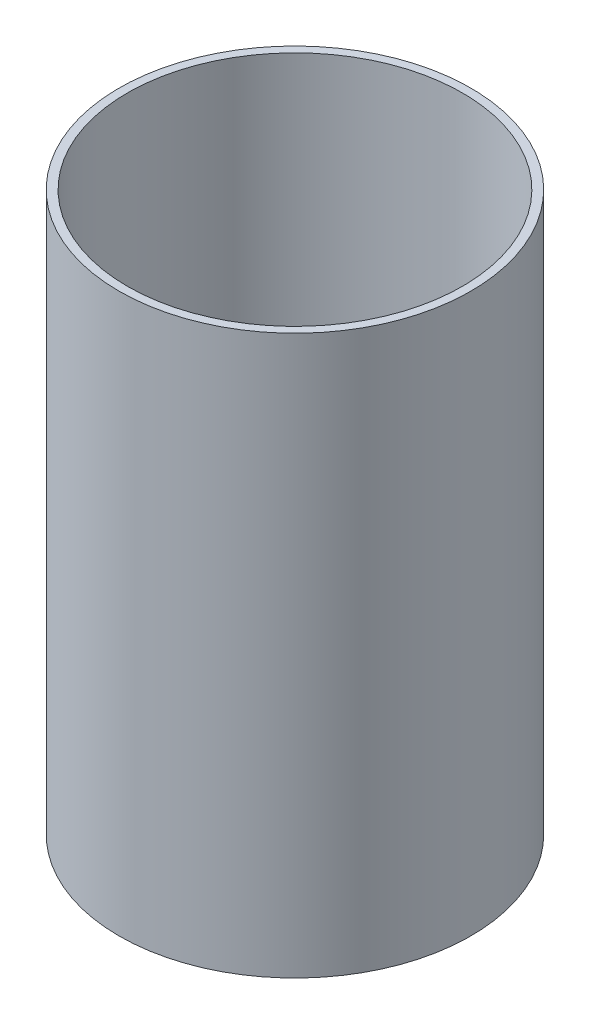
ISO-10303-21;
HEADER;
FILE_DESCRIPTION(('STEP AP214'),'2;1');
FILE_NAME('part.step','',(''),(''),'','','');
FILE_SCHEMA(('AUTOMOTIVE_DESIGN { 1 0 10303 214 1 1 1 1 }'));
ENDSEC;
DATA;
#1=APPLICATION_CONTEXT('core data for automotive mechanical design processes');
#2=APPLICATION_PROTOCOL_DEFINITION('international standard','automotive_design',2000,#1);
#3=PRODUCT_CONTEXT('',#1,'mechanical');
#4=PRODUCT('Part','Part','',(#3));
#5=PRODUCT_RELATED_PRODUCT_CATEGORY('part','',(#4));
#6=PRODUCT_DEFINITION_FORMATION('','',#4);
#7=PRODUCT_DEFINITION_CONTEXT('part definition',#1,'design');
#8=PRODUCT_DEFINITION('design','',#6,#7);
#9=PRODUCT_DEFINITION_SHAPE('','',#8);
#10=(LENGTH_UNIT() NAMED_UNIT(*) SI_UNIT(.MILLI.,.METRE.));
#11=(NAMED_UNIT(*) PLANE_ANGLE_UNIT() SI_UNIT($,.RADIAN.));
#12=(NAMED_UNIT(*) SI_UNIT($,.STERADIAN.) SOLID_ANGLE_UNIT());
#13=UNCERTAINTY_MEASURE_WITH_UNIT(LENGTH_MEASURE(1.E-05),#10,'distance_accuracy_value','');
#14=(GEOMETRIC_REPRESENTATION_CONTEXT(3) GLOBAL_UNCERTAINTY_ASSIGNED_CONTEXT((#13)) GLOBAL_UNIT_ASSIGNED_CONTEXT((#10,
#11,#12)) REPRESENTATION_CONTEXT('',''));
#15=CARTESIAN_POINT('',(0.,0.,0.));
#16=DIRECTION('',(0.,0.,1.));
#17=DIRECTION('',(1.,0.,0.));
#18=AXIS2_PLACEMENT_3D('',#15,#16,#17);
#19=CARTESIAN_POINT('',(0.,100.,0.));
#20=DIRECTION('',(0.,1.,0.));
#21=DIRECTION('',(0.,0.,1.));
#22=AXIS2_PLACEMENT_3D('',#19,#20,#21);
#23=PLANE('',#22);
#24=CARTESIAN_POINT('',(0.,100.,0.));
#25=DIRECTION('',(0.,1.,0.));
#26=DIRECTION('',(0.,0.,1.));
#27=AXIS2_PLACEMENT_3D('',#24,#25,#26);
#28=CIRCLE('',#27,31.5);
#29=CARTESIAN_POINT('',(0.,100.,31.5));
#30=VERTEX_POINT('',#29);
#31=EDGE_CURVE('E10',#30,#30,#28,.T.);
#32=ORIENTED_EDGE('',*,*,#31,.T.);
#33=EDGE_LOOP('',(#32));
#34=FACE_BOUND('',#33,.T.);
#35=CARTESIAN_POINT('',(0.,100.,0.));
#36=DIRECTION('',(0.,1.,0.));
#37=DIRECTION('',(0.,0.,1.));
#38=AXIS2_PLACEMENT_3D('',#35,#36,#37);
#39=CIRCLE('',#38,30.);
#40=CARTESIAN_POINT('',(0.,100.,30.));
#41=VERTEX_POINT('',#40);
#42=EDGE_CURVE('E43',#41,#41,#39,.T.);
#43=ORIENTED_EDGE('',*,*,#42,.F.);
#44=EDGE_LOOP('',(#43));
#45=FACE_BOUND('',#44,.T.);
#46=ADVANCED_FACE('F32',(#34,#45),#23,.T.);
#47=CARTESIAN_POINT('',(0.,0.,0.));
#48=DIRECTION('',(0.,1.,0.));
#49=DIRECTION('',(0.,0.,1.));
#50=AXIS2_PLACEMENT_3D('',#47,#48,#49);
#51=PLANE('',#50);
#52=CARTESIAN_POINT('',(0.,0.,0.));
#53=DIRECTION('',(0.,1.,0.));
#54=DIRECTION('',(0.,0.,1.));
#55=AXIS2_PLACEMENT_3D('',#52,#53,#54);
#56=CIRCLE('',#55,31.5);
#57=CARTESIAN_POINT('',(0.,0.,31.5));
#58=VERTEX_POINT('',#57);
#59=EDGE_CURVE('E36',#58,#58,#56,.T.);
#60=ORIENTED_EDGE('',*,*,#59,.F.);
#61=EDGE_LOOP('',(#60));
#62=FACE_BOUND('',#61,.T.);
#63=CARTESIAN_POINT('',(0.,0.,0.));
#64=DIRECTION('',(0.,1.,0.));
#65=DIRECTION('',(0.,0.,1.));
#66=AXIS2_PLACEMENT_3D('',#63,#64,#65);
#67=CIRCLE('',#66,30.);
#68=CARTESIAN_POINT('',(0.,0.,30.));
#69=VERTEX_POINT('',#68);
#70=EDGE_CURVE('E45',#69,#69,#67,.T.);
#71=ORIENTED_EDGE('',*,*,#70,.T.);
#72=EDGE_LOOP('',(#71));
#73=FACE_BOUND('',#72,.T.);
#74=ADVANCED_FACE('F55',(#62,#73),#51,.F.);
#75=CARTESIAN_POINT('',(0.,100.,0.));
#76=DIRECTION('',(0.,-1.,0.));
#77=DIRECTION('',(0.,0.,-1.));
#78=AXIS2_PLACEMENT_3D('',#75,#76,#77);
#79=CYLINDRICAL_SURFACE('',#78,31.5);
#80=ORIENTED_EDGE('',*,*,#31,.F.);
#81=EDGE_LOOP('',(#80));
#82=FACE_BOUND('',#81,.T.);
#83=ORIENTED_EDGE('',*,*,#59,.T.);
#84=EDGE_LOOP('',(#83));
#85=FACE_BOUND('',#84,.T.);
#86=ADVANCED_FACE('F34',(#82,#85),#79,.T.);
#87=CARTESIAN_POINT('',(0.,100.,0.));
#88=DIRECTION('',(0.,-1.,0.));
#89=DIRECTION('',(0.,0.,-1.));
#90=AXIS2_PLACEMENT_3D('',#87,#88,#89);
#91=CYLINDRICAL_SURFACE('',#90,30.);
#92=ORIENTED_EDGE('',*,*,#42,.T.);
#93=EDGE_LOOP('',(#92));
#94=FACE_BOUND('',#93,.T.);
#95=ORIENTED_EDGE('',*,*,#70,.F.);
#96=EDGE_LOOP('',(#95));
#97=FACE_BOUND('',#96,.T.);
#98=ADVANCED_FACE('F51',(#94,#97),#91,.F.);
#99=CLOSED_SHELL('',(#46,#74,#86,#98));
#100=MANIFOLD_SOLID_BREP('B2',#99);
#101=ADVANCED_BREP_SHAPE_REPRESENTATION('',(#18,#100),#14);
#102=SHAPE_DEFINITION_REPRESENTATION(#9,#101);
ENDSEC;
END-ISO-10303-21;
